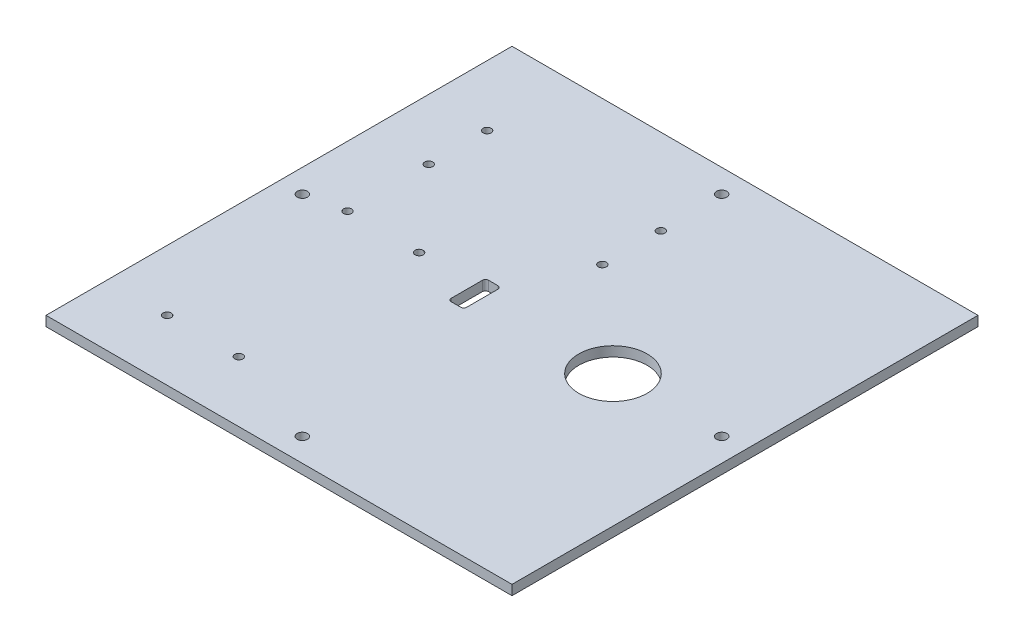
ISO-10303-21;
HEADER;
FILE_DESCRIPTION(('STEP AP214'),'2;1');
FILE_NAME('part.step','',(''),(''),'','','');
FILE_SCHEMA(('AUTOMOTIVE_DESIGN { 1 0 10303 214 1 1 1 1 }'));
ENDSEC;
DATA;
#1=APPLICATION_CONTEXT('core data for automotive mechanical design processes');
#2=APPLICATION_PROTOCOL_DEFINITION('international standard','automotive_design',2000,#1);
#3=PRODUCT_CONTEXT('',#1,'mechanical');
#4=PRODUCT('Part','Part','',(#3));
#5=PRODUCT_RELATED_PRODUCT_CATEGORY('part','',(#4));
#6=PRODUCT_DEFINITION_FORMATION('','',#4);
#7=PRODUCT_DEFINITION_CONTEXT('part definition',#1,'design');
#8=PRODUCT_DEFINITION('design','',#6,#7);
#9=PRODUCT_DEFINITION_SHAPE('','',#8);
#10=(LENGTH_UNIT() NAMED_UNIT(*) SI_UNIT(.MILLI.,.METRE.));
#11=(NAMED_UNIT(*) PLANE_ANGLE_UNIT() SI_UNIT($,.RADIAN.));
#12=(NAMED_UNIT(*) SI_UNIT($,.STERADIAN.) SOLID_ANGLE_UNIT());
#13=UNCERTAINTY_MEASURE_WITH_UNIT(LENGTH_MEASURE(1.E-05),#10,'distance_accuracy_value','');
#14=(GEOMETRIC_REPRESENTATION_CONTEXT(3) GLOBAL_UNCERTAINTY_ASSIGNED_CONTEXT((#13)) GLOBAL_UNIT_ASSIGNED_CONTEXT((#10,
#11,#12)) REPRESENTATION_CONTEXT('',''));
#15=CARTESIAN_POINT('',(0.,0.,0.));
#16=DIRECTION('',(0.,0.,1.));
#17=DIRECTION('',(1.,0.,0.));
#18=AXIS2_PLACEMENT_3D('',#15,#16,#17);
#19=CARTESIAN_POINT('',(0.,3.175,0.));
#20=DIRECTION('',(0.,1.,0.));
#21=DIRECTION('',(0.,0.,1.));
#22=AXIS2_PLACEMENT_3D('',#19,#20,#21);
#23=PLANE('',#22);
#24=CARTESIAN_POINT('',(-55.5,3.175,-47.5));
#25=DIRECTION('',(0.,1.,0.));
#26=DIRECTION('',(0.,0.,1.));
#27=AXIS2_PLACEMENT_3D('',#24,#25,#26);
#28=CIRCLE('',#27,1.3);
#29=CARTESIAN_POINT('',(-55.5,3.175,-46.2));
#30=VERTEX_POINT('',#29);
#31=EDGE_CURVE('E193',#30,#30,#28,.T.);
#32=ORIENTED_EDGE('',*,*,#31,.F.);
#33=EDGE_LOOP('',(#32));
#34=FACE_BOUND('',#33,.T.);
#35=CARTESIAN_POINT('',(0.400000000000032,3.175,-47.5));
#36=DIRECTION('',(0.,1.,0.));
#37=DIRECTION('',(0.,0.,1.));
#38=AXIS2_PLACEMENT_3D('',#35,#36,#37);
#39=CIRCLE('',#38,1.3);
#40=CARTESIAN_POINT('',(0.400000000000032,3.175,-46.2));
#41=VERTEX_POINT('',#40);
#42=EDGE_CURVE('E205',#41,#41,#39,.T.);
#43=ORIENTED_EDGE('',*,*,#42,.F.);
#44=EDGE_LOOP('',(#43));
#45=FACE_BOUND('',#44,.T.);
#46=CARTESIAN_POINT('',(-32.45,3.175,-2.54999999999999));
#47=DIRECTION('',(0.,1.,0.));
#48=DIRECTION('',(0.,0.,1.));
#49=AXIS2_PLACEMENT_3D('',#46,#47,#48);
#50=CIRCLE('',#49,1.3);
#51=CARTESIAN_POINT('',(-32.45,3.175,-1.24999999999999));
#52=VERTEX_POINT('',#51);
#53=EDGE_CURVE('E217',#52,#52,#50,.T.);
#54=ORIENTED_EDGE('',*,*,#53,.F.);
#55=EDGE_LOOP('',(#54));
#56=FACE_BOUND('',#55,.T.);
#57=CARTESIAN_POINT('',(-55.5,3.175,55.5));
#58=DIRECTION('',(0.,1.,0.));
#59=DIRECTION('',(0.,0.,1.));
#60=AXIS2_PLACEMENT_3D('',#57,#58,#59);
#61=CIRCLE('',#60,1.3);
#62=CARTESIAN_POINT('',(-55.5,3.175,56.8));
#63=VERTEX_POINT('',#62);
#64=EDGE_CURVE('E229',#63,#63,#61,.T.);
#65=ORIENTED_EDGE('',*,*,#64,.F.);
#66=EDGE_LOOP('',(#65));
#67=FACE_BOUND('',#66,.T.);
#68=CARTESIAN_POINT('',(0.,3.175,67.5));
#69=DIRECTION('',(0.,1.,0.));
#70=DIRECTION('',(0.,0.,1.));
#71=AXIS2_PLACEMENT_3D('',#68,#69,#70);
#72=CIRCLE('',#71,1.65);
#73=CARTESIAN_POINT('',(0.,3.175,69.15));
#74=VERTEX_POINT('',#73);
#75=EDGE_CURVE('E241',#74,#74,#72,.T.);
#76=ORIENTED_EDGE('',*,*,#75,.F.);
#77=EDGE_LOOP('',(#76));
#78=FACE_BOUND('',#77,.T.);
#79=CARTESIAN_POINT('',(0.,3.175,-67.5));
#80=DIRECTION('',(0.,1.,0.));
#81=DIRECTION('',(0.,0.,1.));
#82=AXIS2_PLACEMENT_3D('',#79,#80,#81);
#83=CIRCLE('',#82,1.65);
#84=CARTESIAN_POINT('',(0.,3.175,-65.85));
#85=VERTEX_POINT('',#84);
#86=EDGE_CURVE('E253',#85,#85,#83,.T.);
#87=ORIENTED_EDGE('',*,*,#86,.F.);
#88=EDGE_LOOP('',(#87));
#89=FACE_BOUND('',#88,.T.);
#90=DIRECTION('',(0.,0.,-1.));
#91=VECTOR('',#90,1.);
#92=CARTESIAN_POINT('',(75.,3.175,-75.));
#93=LINE('',#92,#91);
#94=CARTESIAN_POINT('',(75.,3.175,75.));
#95=VERTEX_POINT('',#94);
#96=CARTESIAN_POINT('',(75.,3.175,-75.));
#97=VERTEX_POINT('',#96);
#98=EDGE_CURVE('E265',#95,#97,#93,.T.);
#99=ORIENTED_EDGE('',*,*,#98,.T.);
#100=DIRECTION('',(-1.,0.,0.));
#101=VECTOR('',#100,1.);
#102=CARTESIAN_POINT('',(-75.,3.175,-75.));
#103=LINE('',#102,#101);
#104=CARTESIAN_POINT('',(-75.,3.175,-75.));
#105=VERTEX_POINT('',#104);
#106=EDGE_CURVE('E268',#97,#105,#103,.T.);
#107=ORIENTED_EDGE('',*,*,#106,.T.);
#108=DIRECTION('',(0.,0.,1.));
#109=VECTOR('',#108,1.);
#110=CARTESIAN_POINT('',(-75.,3.175,-75.));
#111=LINE('',#110,#109);
#112=CARTESIAN_POINT('',(-75.,3.175,75.));
#113=VERTEX_POINT('',#112);
#114=EDGE_CURVE('E271',#105,#113,#111,.T.);
#115=ORIENTED_EDGE('',*,*,#114,.T.);
#116=DIRECTION('',(1.,0.,0.));
#117=VECTOR('',#116,1.);
#118=CARTESIAN_POINT('',(-75.,3.175,75.));
#119=LINE('',#118,#117);
#120=EDGE_CURVE('E273',#113,#95,#119,.T.);
#121=ORIENTED_EDGE('',*,*,#120,.T.);
#122=EDGE_LOOP('',(#99,#107,#115,#121));
#123=FACE_BOUND('',#122,.T.);
#124=CARTESIAN_POINT('',(-67.5,3.175,0.));
#125=DIRECTION('',(0.,1.,0.));
#126=DIRECTION('',(0.,0.,1.));
#127=AXIS2_PLACEMENT_3D('',#124,#125,#126);
#128=CIRCLE('',#127,1.65);
#129=CARTESIAN_POINT('',(-67.5,3.175,1.65000000000002));
#130=VERTEX_POINT('',#129);
#131=EDGE_CURVE('E259',#130,#130,#128,.T.);
#132=ORIENTED_EDGE('',*,*,#131,.F.);
#133=EDGE_LOOP('',(#132));
#134=FACE_BOUND('',#133,.T.);
#135=CARTESIAN_POINT('',(67.5,3.175,0.));
#136=DIRECTION('',(0.,1.,0.));
#137=DIRECTION('',(0.,0.,1.));
#138=AXIS2_PLACEMENT_3D('',#135,#136,#137);
#139=CIRCLE('',#138,1.65);
#140=CARTESIAN_POINT('',(67.5,3.175,1.65000000000002));
#141=VERTEX_POINT('',#140);
#142=EDGE_CURVE('E247',#141,#141,#139,.T.);
#143=ORIENTED_EDGE('',*,*,#142,.F.);
#144=EDGE_LOOP('',(#143));
#145=FACE_BOUND('',#144,.T.);
#146=CARTESIAN_POINT('',(32.5,3.175,0.));
#147=DIRECTION('',(0.,1.,0.));
#148=DIRECTION('',(0.,0.,1.));
#149=AXIS2_PLACEMENT_3D('',#146,#147,#148);
#150=CIRCLE('',#149,11.);
#151=CARTESIAN_POINT('',(32.5,3.175,11.));
#152=VERTEX_POINT('',#151);
#153=EDGE_CURVE('E235',#152,#152,#150,.T.);
#154=ORIENTED_EDGE('',*,*,#153,.F.);
#155=EDGE_LOOP('',(#154));
#156=FACE_BOUND('',#155,.T.);
#157=CARTESIAN_POINT('',(-32.45,3.175,55.5));
#158=DIRECTION('',(0.,1.,0.));
#159=DIRECTION('',(0.,0.,1.));
#160=AXIS2_PLACEMENT_3D('',#157,#158,#159);
#161=CIRCLE('',#160,1.3);
#162=CARTESIAN_POINT('',(-32.45,3.175,56.8));
#163=VERTEX_POINT('',#162);
#164=EDGE_CURVE('E223',#163,#163,#161,.T.);
#165=ORIENTED_EDGE('',*,*,#164,.F.);
#166=EDGE_LOOP('',(#165));
#167=FACE_BOUND('',#166,.T.);
#168=CARTESIAN_POINT('',(-55.5,3.175,-2.54999999999999));
#169=DIRECTION('',(0.,1.,0.));
#170=DIRECTION('',(0.,0.,1.));
#171=AXIS2_PLACEMENT_3D('',#168,#169,#170);
#172=CIRCLE('',#171,1.3);
#173=CARTESIAN_POINT('',(-55.5,3.175,-1.24999999999999));
#174=VERTEX_POINT('',#173);
#175=EDGE_CURVE('E211',#174,#174,#172,.T.);
#176=ORIENTED_EDGE('',*,*,#175,.F.);
#177=EDGE_LOOP('',(#176));
#178=FACE_BOUND('',#177,.T.);
#179=CARTESIAN_POINT('',(0.400000000000032,3.175,-28.7));
#180=DIRECTION('',(0.,1.,0.));
#181=DIRECTION('',(0.,0.,1.));
#182=AXIS2_PLACEMENT_3D('',#179,#180,#181);
#183=CIRCLE('',#182,1.30000000000001);
#184=CARTESIAN_POINT('',(0.400000000000032,3.175,-27.4));
#185=VERTEX_POINT('',#184);
#186=EDGE_CURVE('E199',#185,#185,#183,.T.);
#187=ORIENTED_EDGE('',*,*,#186,.F.);
#188=EDGE_LOOP('',(#187));
#189=FACE_BOUND('',#188,.T.);
#190=CARTESIAN_POINT('',(-55.5,3.175,-28.7));
#191=DIRECTION('',(0.,1.,0.));
#192=DIRECTION('',(0.,0.,1.));
#193=AXIS2_PLACEMENT_3D('',#190,#191,#192);
#194=CIRCLE('',#193,1.3);
#195=CARTESIAN_POINT('',(-55.5,3.175,-27.4));
#196=VERTEX_POINT('',#195);
#197=EDGE_CURVE('E187',#196,#196,#194,.T.);
#198=ORIENTED_EDGE('',*,*,#197,.F.);
#199=EDGE_LOOP('',(#198));
#200=FACE_BOUND('',#199,.T.);
#201=DIRECTION('',(1.,0.,0.));
#202=VECTOR('',#201,1.);
#203=CARTESIAN_POINT('',(-13.5342899910378,3.175,5.99999999999999));
#204=LINE('',#203,#202);
#205=CARTESIAN_POINT('',(-13.5342899910378,3.175,5.99999999999999));
#206=VERTEX_POINT('',#205);
#207=CARTESIAN_POINT('',(-10.5342899910378,3.175,5.99999999999998));
#208=VERTEX_POINT('',#207);
#209=EDGE_CURVE('E130',#206,#208,#204,.T.);
#210=ORIENTED_EDGE('',*,*,#209,.F.);
#211=CARTESIAN_POINT('',(-13.5342899910378,3.175,4.99999999999999));
#212=DIRECTION('',(0.,1.,0.));
#213=DIRECTION('',(0.,0.,-1.));
#214=AXIS2_PLACEMENT_3D('',#211,#212,#213);
#215=CIRCLE('',#214,1.);
#216=CARTESIAN_POINT('',(-14.5342899910378,3.175,4.99999999999999));
#217=VERTEX_POINT('',#216);
#218=EDGE_CURVE('E122',#217,#206,#215,.T.);
#219=ORIENTED_EDGE('',*,*,#218,.F.);
#220=DIRECTION('',(0.,0.,1.));
#221=VECTOR('',#220,1.);
#222=CARTESIAN_POINT('',(-14.5342899910378,3.175,4.99999999999999));
#223=LINE('',#222,#221);
#224=CARTESIAN_POINT('',(-14.5342899910378,3.175,-5.00000000000001));
#225=VERTEX_POINT('',#224);
#226=EDGE_CURVE('E155',#225,#217,#223,.T.);
#227=ORIENTED_EDGE('',*,*,#226,.F.);
#228=CARTESIAN_POINT('',(-13.5342899910378,3.175,-5.00000000000001));
#229=DIRECTION('',(0.,1.,0.));
#230=DIRECTION('',(0.,0.,-1.));
#231=AXIS2_PLACEMENT_3D('',#228,#229,#230);
#232=CIRCLE('',#231,1.);
#233=CARTESIAN_POINT('',(-13.5342899910378,3.175,-6.00000000000001));
#234=VERTEX_POINT('',#233);
#235=EDGE_CURVE('E153',#234,#225,#232,.T.);
#236=ORIENTED_EDGE('',*,*,#235,.F.);
#237=DIRECTION('',(-1.,0.,0.));
#238=VECTOR('',#237,1.);
#239=CARTESIAN_POINT('',(-13.5342899910378,3.175,-6.00000000000001));
#240=LINE('',#239,#238);
#241=CARTESIAN_POINT('',(-10.5342899910378,3.175,-6.00000000000001));
#242=VERTEX_POINT('',#241);
#243=EDGE_CURVE('E151',#242,#234,#240,.T.);
#244=ORIENTED_EDGE('',*,*,#243,.F.);
#245=CARTESIAN_POINT('',(-10.5342899910378,3.175,-5.00000000000001));
#246=DIRECTION('',(0.,1.,0.));
#247=DIRECTION('',(0.,0.,-1.));
#248=AXIS2_PLACEMENT_3D('',#245,#246,#247);
#249=CIRCLE('',#248,1.);
#250=CARTESIAN_POINT('',(-9.5342899910378,3.175,-5.00000000000001));
#251=VERTEX_POINT('',#250);
#252=EDGE_CURVE('E149',#251,#242,#249,.T.);
#253=ORIENTED_EDGE('',*,*,#252,.F.);
#254=DIRECTION('',(0.,0.,-1.));
#255=VECTOR('',#254,1.);
#256=CARTESIAN_POINT('',(-9.5342899910378,3.175,4.99999999999999));
#257=LINE('',#256,#255);
#258=CARTESIAN_POINT('',(-9.5342899910378,3.175,4.99999999999999));
#259=VERTEX_POINT('',#258);
#260=EDGE_CURVE('E145',#259,#251,#257,.T.);
#261=ORIENTED_EDGE('',*,*,#260,.F.);
#262=CARTESIAN_POINT('',(-10.5342899910378,3.175,4.99999999999999));
#263=DIRECTION('',(0.,1.,0.));
#264=DIRECTION('',(0.,0.,1.));
#265=AXIS2_PLACEMENT_3D('',#262,#263,#264);
#266=CIRCLE('',#265,1.);
#267=EDGE_CURVE('E143',#208,#259,#266,.T.);
#268=ORIENTED_EDGE('',*,*,#267,.F.);
#269=EDGE_LOOP('',(#210,#219,#227,#236,#244,#253,#261,#268));
#270=FACE_BOUND('',#269,.T.);
#271=ADVANCED_FACE('F33',(#34,#45,#56,#67,#78,#89,#123,#134,#145,#156,#167,#178,#189,#200,#270),
#23,.T.);
#272=CARTESIAN_POINT('',(0.,0.,0.));
#273=DIRECTION('',(0.,1.,0.));
#274=DIRECTION('',(0.,0.,1.));
#275=AXIS2_PLACEMENT_3D('',#272,#273,#274);
#276=PLANE('',#275);
#277=CARTESIAN_POINT('',(-55.5,0.,-28.7));
#278=DIRECTION('',(0.,1.,0.));
#279=DIRECTION('',(0.,0.,1.));
#280=AXIS2_PLACEMENT_3D('',#277,#278,#279);
#281=CIRCLE('',#280,1.3);
#282=CARTESIAN_POINT('',(-55.5,0.,-27.4));
#283=VERTEX_POINT('',#282);
#284=EDGE_CURVE('E138',#283,#283,#281,.T.);
#285=ORIENTED_EDGE('',*,*,#284,.T.);
#286=EDGE_LOOP('',(#285));
#287=FACE_BOUND('',#286,.T.);
#288=CARTESIAN_POINT('',(-55.5,0.,-47.5));
#289=DIRECTION('',(0.,1.,0.));
#290=DIRECTION('',(0.,0.,1.));
#291=AXIS2_PLACEMENT_3D('',#288,#289,#290);
#292=CIRCLE('',#291,1.3);
#293=CARTESIAN_POINT('',(-55.5,0.,-46.2));
#294=VERTEX_POINT('',#293);
#295=EDGE_CURVE('E190',#294,#294,#292,.T.);
#296=ORIENTED_EDGE('',*,*,#295,.T.);
#297=EDGE_LOOP('',(#296));
#298=FACE_BOUND('',#297,.T.);
#299=CARTESIAN_POINT('',(0.400000000000032,0.,-28.7));
#300=DIRECTION('',(0.,1.,0.));
#301=DIRECTION('',(0.,0.,1.));
#302=AXIS2_PLACEMENT_3D('',#299,#300,#301);
#303=CIRCLE('',#302,1.30000000000001);
#304=CARTESIAN_POINT('',(0.400000000000032,0.,-27.4));
#305=VERTEX_POINT('',#304);
#306=EDGE_CURVE('E196',#305,#305,#303,.T.);
#307=ORIENTED_EDGE('',*,*,#306,.T.);
#308=EDGE_LOOP('',(#307));
#309=FACE_BOUND('',#308,.T.);
#310=CARTESIAN_POINT('',(0.400000000000032,0.,-47.5));
#311=DIRECTION('',(0.,1.,0.));
#312=DIRECTION('',(0.,0.,1.));
#313=AXIS2_PLACEMENT_3D('',#310,#311,#312);
#314=CIRCLE('',#313,1.3);
#315=CARTESIAN_POINT('',(0.400000000000032,0.,-46.2));
#316=VERTEX_POINT('',#315);
#317=EDGE_CURVE('E202',#316,#316,#314,.T.);
#318=ORIENTED_EDGE('',*,*,#317,.T.);
#319=EDGE_LOOP('',(#318));
#320=FACE_BOUND('',#319,.T.);
#321=CARTESIAN_POINT('',(-55.5,0.,-2.54999999999999));
#322=DIRECTION('',(0.,1.,0.));
#323=DIRECTION('',(0.,0.,1.));
#324=AXIS2_PLACEMENT_3D('',#321,#322,#323);
#325=CIRCLE('',#324,1.3);
#326=CARTESIAN_POINT('',(-55.5,0.,-1.24999999999999));
#327=VERTEX_POINT('',#326);
#328=EDGE_CURVE('E208',#327,#327,#325,.T.);
#329=ORIENTED_EDGE('',*,*,#328,.T.);
#330=EDGE_LOOP('',(#329));
#331=FACE_BOUND('',#330,.T.);
#332=CARTESIAN_POINT('',(-32.45,0.,-2.54999999999999));
#333=DIRECTION('',(0.,1.,0.));
#334=DIRECTION('',(0.,0.,1.));
#335=AXIS2_PLACEMENT_3D('',#332,#333,#334);
#336=CIRCLE('',#335,1.3);
#337=CARTESIAN_POINT('',(-32.45,0.,-1.24999999999999));
#338=VERTEX_POINT('',#337);
#339=EDGE_CURVE('E214',#338,#338,#336,.T.);
#340=ORIENTED_EDGE('',*,*,#339,.T.);
#341=EDGE_LOOP('',(#340));
#342=FACE_BOUND('',#341,.T.);
#343=CARTESIAN_POINT('',(-32.45,0.,55.5));
#344=DIRECTION('',(0.,1.,0.));
#345=DIRECTION('',(0.,0.,1.));
#346=AXIS2_PLACEMENT_3D('',#343,#344,#345);
#347=CIRCLE('',#346,1.3);
#348=CARTESIAN_POINT('',(-32.45,0.,56.8));
#349=VERTEX_POINT('',#348);
#350=EDGE_CURVE('E220',#349,#349,#347,.T.);
#351=ORIENTED_EDGE('',*,*,#350,.T.);
#352=EDGE_LOOP('',(#351));
#353=FACE_BOUND('',#352,.T.);
#354=CARTESIAN_POINT('',(-55.5,0.,55.5));
#355=DIRECTION('',(0.,1.,0.));
#356=DIRECTION('',(0.,0.,1.));
#357=AXIS2_PLACEMENT_3D('',#354,#355,#356);
#358=CIRCLE('',#357,1.3);
#359=CARTESIAN_POINT('',(-55.5,0.,56.8));
#360=VERTEX_POINT('',#359);
#361=EDGE_CURVE('E226',#360,#360,#358,.T.);
#362=ORIENTED_EDGE('',*,*,#361,.T.);
#363=EDGE_LOOP('',(#362));
#364=FACE_BOUND('',#363,.T.);
#365=CARTESIAN_POINT('',(32.5,0.,0.));
#366=DIRECTION('',(0.,1.,0.));
#367=DIRECTION('',(0.,0.,1.));
#368=AXIS2_PLACEMENT_3D('',#365,#366,#367);
#369=CIRCLE('',#368,11.);
#370=CARTESIAN_POINT('',(32.5,0.,11.));
#371=VERTEX_POINT('',#370);
#372=EDGE_CURVE('E232',#371,#371,#369,.T.);
#373=ORIENTED_EDGE('',*,*,#372,.T.);
#374=EDGE_LOOP('',(#373));
#375=FACE_BOUND('',#374,.T.);
#376=CARTESIAN_POINT('',(0.,0.,67.5));
#377=DIRECTION('',(0.,1.,0.));
#378=DIRECTION('',(0.,0.,1.));
#379=AXIS2_PLACEMENT_3D('',#376,#377,#378);
#380=CIRCLE('',#379,1.65);
#381=CARTESIAN_POINT('',(0.,0.,69.15));
#382=VERTEX_POINT('',#381);
#383=EDGE_CURVE('E238',#382,#382,#380,.T.);
#384=ORIENTED_EDGE('',*,*,#383,.T.);
#385=EDGE_LOOP('',(#384));
#386=FACE_BOUND('',#385,.T.);
#387=CARTESIAN_POINT('',(67.5,0.,0.));
#388=DIRECTION('',(0.,1.,0.));
#389=DIRECTION('',(0.,0.,1.));
#390=AXIS2_PLACEMENT_3D('',#387,#388,#389);
#391=CIRCLE('',#390,1.65);
#392=CARTESIAN_POINT('',(67.5,0.,1.65000000000002));
#393=VERTEX_POINT('',#392);
#394=EDGE_CURVE('E244',#393,#393,#391,.T.);
#395=ORIENTED_EDGE('',*,*,#394,.T.);
#396=EDGE_LOOP('',(#395));
#397=FACE_BOUND('',#396,.T.);
#398=CARTESIAN_POINT('',(0.,0.,-67.5));
#399=DIRECTION('',(0.,1.,0.));
#400=DIRECTION('',(0.,0.,1.));
#401=AXIS2_PLACEMENT_3D('',#398,#399,#400);
#402=CIRCLE('',#401,1.65);
#403=CARTESIAN_POINT('',(0.,0.,-65.85));
#404=VERTEX_POINT('',#403);
#405=EDGE_CURVE('E250',#404,#404,#402,.T.);
#406=ORIENTED_EDGE('',*,*,#405,.T.);
#407=EDGE_LOOP('',(#406));
#408=FACE_BOUND('',#407,.T.);
#409=CARTESIAN_POINT('',(-67.5,0.,0.));
#410=DIRECTION('',(0.,1.,0.));
#411=DIRECTION('',(0.,0.,1.));
#412=AXIS2_PLACEMENT_3D('',#409,#410,#411);
#413=CIRCLE('',#412,1.65);
#414=CARTESIAN_POINT('',(-67.5,0.,1.65000000000002));
#415=VERTEX_POINT('',#414);
#416=EDGE_CURVE('E256',#415,#415,#413,.T.);
#417=ORIENTED_EDGE('',*,*,#416,.T.);
#418=EDGE_LOOP('',(#417));
#419=FACE_BOUND('',#418,.T.);
#420=DIRECTION('',(0.,0.,-1.));
#421=VECTOR('',#420,1.);
#422=CARTESIAN_POINT('',(75.,0.,-75.));
#423=LINE('',#422,#421);
#424=CARTESIAN_POINT('',(75.,0.,75.));
#425=VERTEX_POINT('',#424);
#426=CARTESIAN_POINT('',(75.,0.,-75.));
#427=VERTEX_POINT('',#426);
#428=EDGE_CURVE('E262',#425,#427,#423,.T.);
#429=ORIENTED_EDGE('',*,*,#428,.F.);
#430=DIRECTION('',(1.,0.,0.));
#431=VECTOR('',#430,1.);
#432=CARTESIAN_POINT('',(-75.,0.,75.));
#433=LINE('',#432,#431);
#434=CARTESIAN_POINT('',(-75.,0.,75.));
#435=VERTEX_POINT('',#434);
#436=EDGE_CURVE('E269',#435,#425,#433,.T.);
#437=ORIENTED_EDGE('',*,*,#436,.F.);
#438=DIRECTION('',(0.,0.,1.));
#439=VECTOR('',#438,1.);
#440=CARTESIAN_POINT('',(-75.,0.,-75.));
#441=LINE('',#440,#439);
#442=CARTESIAN_POINT('',(-75.,0.,-75.));
#443=VERTEX_POINT('',#442);
#444=EDGE_CURVE('E280',#443,#435,#441,.T.);
#445=ORIENTED_EDGE('',*,*,#444,.F.);
#446=DIRECTION('',(-1.,0.,0.));
#447=VECTOR('',#446,1.);
#448=CARTESIAN_POINT('',(-75.,0.,-75.));
#449=LINE('',#448,#447);
#450=EDGE_CURVE('E278',#427,#443,#449,.T.);
#451=ORIENTED_EDGE('',*,*,#450,.F.);
#452=EDGE_LOOP('',(#429,#437,#445,#451));
#453=FACE_BOUND('',#452,.T.);
#454=CARTESIAN_POINT('',(-13.5342899910378,0.,4.99999999999999));
#455=DIRECTION('',(0.,1.,0.));
#456=DIRECTION('',(0.,0.,-1.));
#457=AXIS2_PLACEMENT_3D('',#454,#455,#456);
#458=CIRCLE('',#457,1.);
#459=CARTESIAN_POINT('',(-14.5342899910378,0.,4.99999999999999));
#460=VERTEX_POINT('',#459);
#461=CARTESIAN_POINT('',(-13.5342899910378,0.,5.99999999999999));
#462=VERTEX_POINT('',#461);
#463=EDGE_CURVE('E56',#460,#462,#458,.T.);
#464=ORIENTED_EDGE('',*,*,#463,.T.);
#465=DIRECTION('',(1.,0.,0.));
#466=VECTOR('',#465,1.);
#467=CARTESIAN_POINT('',(-13.5342899910378,0.,5.99999999999999));
#468=LINE('',#467,#466);
#469=CARTESIAN_POINT('',(-10.5342899910378,0.,5.99999999999998));
#470=VERTEX_POINT('',#469);
#471=EDGE_CURVE('E137',#462,#470,#468,.T.);
#472=ORIENTED_EDGE('',*,*,#471,.T.);
#473=CARTESIAN_POINT('',(-10.5342899910378,0.,4.99999999999999));
#474=DIRECTION('',(0.,1.,0.));
#475=DIRECTION('',(0.,0.,1.));
#476=AXIS2_PLACEMENT_3D('',#473,#474,#475);
#477=CIRCLE('',#476,1.);
#478=CARTESIAN_POINT('',(-9.5342899910378,0.,4.99999999999999));
#479=VERTEX_POINT('',#478);
#480=EDGE_CURVE('E159',#470,#479,#477,.T.);
#481=ORIENTED_EDGE('',*,*,#480,.T.);
#482=DIRECTION('',(0.,0.,-1.));
#483=VECTOR('',#482,1.);
#484=CARTESIAN_POINT('',(-9.5342899910378,0.,4.99999999999999));
#485=LINE('',#484,#483);
#486=CARTESIAN_POINT('',(-9.5342899910378,0.,-5.00000000000001));
#487=VERTEX_POINT('',#486);
#488=EDGE_CURVE('E162',#479,#487,#485,.T.);
#489=ORIENTED_EDGE('',*,*,#488,.T.);
#490=CARTESIAN_POINT('',(-10.5342899910378,0.,-5.00000000000001));
#491=DIRECTION('',(0.,1.,0.));
#492=DIRECTION('',(0.,0.,-1.));
#493=AXIS2_PLACEMENT_3D('',#490,#491,#492);
#494=CIRCLE('',#493,1.);
#495=CARTESIAN_POINT('',(-10.5342899910378,0.,-6.00000000000001));
#496=VERTEX_POINT('',#495);
#497=EDGE_CURVE('E165',#487,#496,#494,.T.);
#498=ORIENTED_EDGE('',*,*,#497,.T.);
#499=DIRECTION('',(-1.,0.,0.));
#500=VECTOR('',#499,1.);
#501=CARTESIAN_POINT('',(-13.5342899910378,0.,-6.00000000000001));
#502=LINE('',#501,#500);
#503=CARTESIAN_POINT('',(-13.5342899910378,0.,-6.00000000000001));
#504=VERTEX_POINT('',#503);
#505=EDGE_CURVE('E168',#496,#504,#502,.T.);
#506=ORIENTED_EDGE('',*,*,#505,.T.);
#507=CARTESIAN_POINT('',(-13.5342899910378,0.,-5.00000000000001));
#508=DIRECTION('',(0.,1.,0.));
#509=DIRECTION('',(0.,0.,-1.));
#510=AXIS2_PLACEMENT_3D('',#507,#508,#509);
#511=CIRCLE('',#510,1.);
#512=CARTESIAN_POINT('',(-14.5342899910378,0.,-5.00000000000001));
#513=VERTEX_POINT('',#512);
#514=EDGE_CURVE('E171',#504,#513,#511,.T.);
#515=ORIENTED_EDGE('',*,*,#514,.T.);
#516=DIRECTION('',(0.,0.,1.));
#517=VECTOR('',#516,1.);
#518=CARTESIAN_POINT('',(-14.5342899910378,0.,4.99999999999999));
#519=LINE('',#518,#517);
#520=EDGE_CURVE('E131',#513,#460,#519,.T.);
#521=ORIENTED_EDGE('',*,*,#520,.T.);
#522=EDGE_LOOP('',(#464,#472,#481,#489,#498,#506,#515,#521));
#523=FACE_BOUND('',#522,.T.);
#524=ADVANCED_FACE('F298',(#287,#298,#309,#320,#331,#342,#353,#364,#375,#386,#397,#408,#419,
#453,#523),#276,.F.);
#525=CARTESIAN_POINT('',(75.,3.175,-75.));
#526=DIRECTION('',(-1.,0.,0.));
#527=DIRECTION('',(0.,0.,1.));
#528=AXIS2_PLACEMENT_3D('',#525,#526,#527);
#529=PLANE('',#528);
#530=ORIENTED_EDGE('',*,*,#428,.T.);
#531=DIRECTION('',(0.,-1.,0.));
#532=VECTOR('',#531,1.);
#533=CARTESIAN_POINT('',(75.,3.175,-75.));
#534=LINE('',#533,#532);
#535=EDGE_CURVE('E11',#97,#427,#534,.T.);
#536=ORIENTED_EDGE('',*,*,#535,.F.);
#537=ORIENTED_EDGE('',*,*,#98,.F.);
#538=DIRECTION('',(0.,-1.,0.));
#539=VECTOR('',#538,1.);
#540=CARTESIAN_POINT('',(75.,3.175,75.));
#541=LINE('',#540,#539);
#542=EDGE_CURVE('E275',#95,#425,#541,.T.);
#543=ORIENTED_EDGE('',*,*,#542,.T.);
#544=EDGE_LOOP('',(#530,#536,#537,#543));
#545=FACE_BOUND('',#544,.T.);
#546=ADVANCED_FACE('F35',(#545),#529,.F.);
#547=CARTESIAN_POINT('',(-75.,3.175,-75.));
#548=DIRECTION('',(0.,0.,1.));
#549=DIRECTION('',(1.,0.,0.));
#550=AXIS2_PLACEMENT_3D('',#547,#548,#549);
#551=PLANE('',#550);
#552=ORIENTED_EDGE('',*,*,#450,.T.);
#553=DIRECTION('',(0.,-1.,0.));
#554=VECTOR('',#553,1.);
#555=CARTESIAN_POINT('',(-75.,3.175,-75.));
#556=LINE('',#555,#554);
#557=EDGE_CURVE('E41',#105,#443,#556,.T.);
#558=ORIENTED_EDGE('',*,*,#557,.F.);
#559=ORIENTED_EDGE('',*,*,#106,.F.);
#560=ORIENTED_EDGE('',*,*,#535,.T.);
#561=EDGE_LOOP('',(#552,#558,#559,#560));
#562=FACE_BOUND('',#561,.T.);
#563=ADVANCED_FACE('F309',(#562),#551,.F.);
#564=CARTESIAN_POINT('',(-75.,3.175,-75.));
#565=DIRECTION('',(1.,0.,0.));
#566=DIRECTION('',(0.,0.,-1.));
#567=AXIS2_PLACEMENT_3D('',#564,#565,#566);
#568=PLANE('',#567);
#569=ORIENTED_EDGE('',*,*,#444,.T.);
#570=DIRECTION('',(0.,-1.,0.));
#571=VECTOR('',#570,1.);
#572=CARTESIAN_POINT('',(-75.,3.175,75.));
#573=LINE('',#572,#571);
#574=EDGE_CURVE('E285',#113,#435,#573,.T.);
#575=ORIENTED_EDGE('',*,*,#574,.F.);
#576=ORIENTED_EDGE('',*,*,#114,.F.);
#577=ORIENTED_EDGE('',*,*,#557,.T.);
#578=EDGE_LOOP('',(#569,#575,#576,#577));
#579=FACE_BOUND('',#578,.T.);
#580=ADVANCED_FACE('F292',(#579),#568,.F.);
#581=CARTESIAN_POINT('',(-75.,3.175,75.));
#582=DIRECTION('',(0.,0.,-1.));
#583=DIRECTION('',(-1.,0.,0.));
#584=AXIS2_PLACEMENT_3D('',#581,#582,#583);
#585=PLANE('',#584);
#586=ORIENTED_EDGE('',*,*,#436,.T.);
#587=ORIENTED_EDGE('',*,*,#542,.F.);
#588=ORIENTED_EDGE('',*,*,#120,.F.);
#589=ORIENTED_EDGE('',*,*,#574,.T.);
#590=EDGE_LOOP('',(#586,#587,#588,#589));
#591=FACE_BOUND('',#590,.T.);
#592=ADVANCED_FACE('F302',(#591),#585,.F.);
#593=CARTESIAN_POINT('',(-67.5,3.175,0.));
#594=DIRECTION('',(0.,-1.,0.));
#595=DIRECTION('',(0.,0.,-1.));
#596=AXIS2_PLACEMENT_3D('',#593,#594,#595);
#597=CYLINDRICAL_SURFACE('',#596,1.65);
#598=ORIENTED_EDGE('',*,*,#131,.T.);
#599=EDGE_LOOP('',(#598));
#600=FACE_BOUND('',#599,.T.);
#601=ORIENTED_EDGE('',*,*,#416,.F.);
#602=EDGE_LOOP('',(#601));
#603=FACE_BOUND('',#602,.T.);
#604=ADVANCED_FACE('F327',(#600,#603),#597,.F.);
#605=CARTESIAN_POINT('',(0.,3.175,-67.5));
#606=DIRECTION('',(0.,-1.,0.));
#607=DIRECTION('',(0.,0.,-1.));
#608=AXIS2_PLACEMENT_3D('',#605,#606,#607);
#609=CYLINDRICAL_SURFACE('',#608,1.65);
#610=ORIENTED_EDGE('',*,*,#86,.T.);
#611=EDGE_LOOP('',(#610));
#612=FACE_BOUND('',#611,.T.);
#613=ORIENTED_EDGE('',*,*,#405,.F.);
#614=EDGE_LOOP('',(#613));
#615=FACE_BOUND('',#614,.T.);
#616=ADVANCED_FACE('F334',(#612,#615),#609,.F.);
#617=CARTESIAN_POINT('',(67.5,3.175,0.));
#618=DIRECTION('',(0.,-1.,0.));
#619=DIRECTION('',(0.,0.,-1.));
#620=AXIS2_PLACEMENT_3D('',#617,#618,#619);
#621=CYLINDRICAL_SURFACE('',#620,1.65);
#622=ORIENTED_EDGE('',*,*,#142,.T.);
#623=EDGE_LOOP('',(#622));
#624=FACE_BOUND('',#623,.T.);
#625=ORIENTED_EDGE('',*,*,#394,.F.);
#626=EDGE_LOOP('',(#625));
#627=FACE_BOUND('',#626,.T.);
#628=ADVANCED_FACE('F339',(#624,#627),#621,.F.);
#629=CARTESIAN_POINT('',(0.,3.175,67.5));
#630=DIRECTION('',(0.,-1.,0.));
#631=DIRECTION('',(0.,0.,-1.));
#632=AXIS2_PLACEMENT_3D('',#629,#630,#631);
#633=CYLINDRICAL_SURFACE('',#632,1.65);
#634=ORIENTED_EDGE('',*,*,#75,.T.);
#635=EDGE_LOOP('',(#634));
#636=FACE_BOUND('',#635,.T.);
#637=ORIENTED_EDGE('',*,*,#383,.F.);
#638=EDGE_LOOP('',(#637));
#639=FACE_BOUND('',#638,.T.);
#640=ADVANCED_FACE('F389',(#636,#639),#633,.F.);
#641=CARTESIAN_POINT('',(32.5,3.175,0.));
#642=DIRECTION('',(0.,-1.,0.));
#643=DIRECTION('',(0.,0.,-1.));
#644=AXIS2_PLACEMENT_3D('',#641,#642,#643);
#645=CYLINDRICAL_SURFACE('',#644,11.);
#646=ORIENTED_EDGE('',*,*,#153,.T.);
#647=EDGE_LOOP('',(#646));
#648=FACE_BOUND('',#647,.T.);
#649=ORIENTED_EDGE('',*,*,#372,.F.);
#650=EDGE_LOOP('',(#649));
#651=FACE_BOUND('',#650,.T.);
#652=ADVANCED_FACE('F395',(#648,#651),#645,.F.);
#653=CARTESIAN_POINT('',(-55.5,3.175,55.5));
#654=DIRECTION('',(0.,-1.,0.));
#655=DIRECTION('',(0.,0.,-1.));
#656=AXIS2_PLACEMENT_3D('',#653,#654,#655);
#657=CYLINDRICAL_SURFACE('',#656,1.3);
#658=ORIENTED_EDGE('',*,*,#64,.T.);
#659=EDGE_LOOP('',(#658));
#660=FACE_BOUND('',#659,.T.);
#661=ORIENTED_EDGE('',*,*,#361,.F.);
#662=EDGE_LOOP('',(#661));
#663=FACE_BOUND('',#662,.T.);
#664=ADVANCED_FACE('F401',(#660,#663),#657,.F.);
#665=CARTESIAN_POINT('',(-32.45,3.175,55.5));
#666=DIRECTION('',(0.,-1.,0.));
#667=DIRECTION('',(0.,0.,-1.));
#668=AXIS2_PLACEMENT_3D('',#665,#666,#667);
#669=CYLINDRICAL_SURFACE('',#668,1.3);
#670=ORIENTED_EDGE('',*,*,#164,.T.);
#671=EDGE_LOOP('',(#670));
#672=FACE_BOUND('',#671,.T.);
#673=ORIENTED_EDGE('',*,*,#350,.F.);
#674=EDGE_LOOP('',(#673));
#675=FACE_BOUND('',#674,.T.);
#676=ADVANCED_FACE('F405',(#672,#675),#669,.F.);
#677=CARTESIAN_POINT('',(-32.45,3.175,-2.54999999999999));
#678=DIRECTION('',(0.,-1.,0.));
#679=DIRECTION('',(0.,0.,-1.));
#680=AXIS2_PLACEMENT_3D('',#677,#678,#679);
#681=CYLINDRICAL_SURFACE('',#680,1.3);
#682=ORIENTED_EDGE('',*,*,#53,.T.);
#683=EDGE_LOOP('',(#682));
#684=FACE_BOUND('',#683,.T.);
#685=ORIENTED_EDGE('',*,*,#339,.F.);
#686=EDGE_LOOP('',(#685));
#687=FACE_BOUND('',#686,.T.);
#688=ADVANCED_FACE('F409',(#684,#687),#681,.F.);
#689=CARTESIAN_POINT('',(-55.5,3.175,-2.54999999999999));
#690=DIRECTION('',(0.,-1.,0.));
#691=DIRECTION('',(0.,0.,-1.));
#692=AXIS2_PLACEMENT_3D('',#689,#690,#691);
#693=CYLINDRICAL_SURFACE('',#692,1.3);
#694=ORIENTED_EDGE('',*,*,#175,.T.);
#695=EDGE_LOOP('',(#694));
#696=FACE_BOUND('',#695,.T.);
#697=ORIENTED_EDGE('',*,*,#328,.F.);
#698=EDGE_LOOP('',(#697));
#699=FACE_BOUND('',#698,.T.);
#700=ADVANCED_FACE('F413',(#696,#699),#693,.F.);
#701=CARTESIAN_POINT('',(0.400000000000032,3.175,-47.5));
#702=DIRECTION('',(0.,-1.,0.));
#703=DIRECTION('',(0.,0.,-1.));
#704=AXIS2_PLACEMENT_3D('',#701,#702,#703);
#705=CYLINDRICAL_SURFACE('',#704,1.3);
#706=ORIENTED_EDGE('',*,*,#42,.T.);
#707=EDGE_LOOP('',(#706));
#708=FACE_BOUND('',#707,.T.);
#709=ORIENTED_EDGE('',*,*,#317,.F.);
#710=EDGE_LOOP('',(#709));
#711=FACE_BOUND('',#710,.T.);
#712=ADVANCED_FACE('F417',(#708,#711),#705,.F.);
#713=CARTESIAN_POINT('',(0.400000000000032,3.175,-28.7));
#714=DIRECTION('',(0.,-1.,0.));
#715=DIRECTION('',(0.,0.,-1.));
#716=AXIS2_PLACEMENT_3D('',#713,#714,#715);
#717=CYLINDRICAL_SURFACE('',#716,1.30000000000001);
#718=ORIENTED_EDGE('',*,*,#186,.T.);
#719=EDGE_LOOP('',(#718));
#720=FACE_BOUND('',#719,.T.);
#721=ORIENTED_EDGE('',*,*,#306,.F.);
#722=EDGE_LOOP('',(#721));
#723=FACE_BOUND('',#722,.T.);
#724=ADVANCED_FACE('F421',(#720,#723),#717,.F.);
#725=CARTESIAN_POINT('',(-55.5,3.175,-47.5));
#726=DIRECTION('',(0.,-1.,0.));
#727=DIRECTION('',(0.,0.,-1.));
#728=AXIS2_PLACEMENT_3D('',#725,#726,#727);
#729=CYLINDRICAL_SURFACE('',#728,1.3);
#730=ORIENTED_EDGE('',*,*,#31,.T.);
#731=EDGE_LOOP('',(#730));
#732=FACE_BOUND('',#731,.T.);
#733=ORIENTED_EDGE('',*,*,#295,.F.);
#734=EDGE_LOOP('',(#733));
#735=FACE_BOUND('',#734,.T.);
#736=ADVANCED_FACE('F361',(#732,#735),#729,.F.);
#737=CARTESIAN_POINT('',(-55.5,3.175,-28.7));
#738=DIRECTION('',(0.,-1.,0.));
#739=DIRECTION('',(0.,0.,-1.));
#740=AXIS2_PLACEMENT_3D('',#737,#738,#739);
#741=CYLINDRICAL_SURFACE('',#740,1.3);
#742=ORIENTED_EDGE('',*,*,#197,.T.);
#743=EDGE_LOOP('',(#742));
#744=FACE_BOUND('',#743,.T.);
#745=ORIENTED_EDGE('',*,*,#284,.F.);
#746=EDGE_LOOP('',(#745));
#747=FACE_BOUND('',#746,.T.);
#748=ADVANCED_FACE('F358',(#744,#747),#741,.F.);
#749=CARTESIAN_POINT('',(-13.5342899910378,3.175,4.99999999999999));
#750=DIRECTION('',(0.,-1.,0.));
#751=DIRECTION('',(0.,0.,-1.));
#752=AXIS2_PLACEMENT_3D('',#749,#750,#751);
#753=CYLINDRICAL_SURFACE('',#752,1.);
#754=ORIENTED_EDGE('',*,*,#463,.F.);
#755=DIRECTION('',(0.,-1.,0.));
#756=VECTOR('',#755,1.);
#757=CARTESIAN_POINT('',(-14.5342899910378,3.175,4.99999999999999));
#758=LINE('',#757,#756);
#759=EDGE_CURVE('E126',#217,#460,#758,.T.);
#760=ORIENTED_EDGE('',*,*,#759,.F.);
#761=ORIENTED_EDGE('',*,*,#218,.T.);
#762=DIRECTION('',(0.,-1.,0.));
#763=VECTOR('',#762,1.);
#764=CARTESIAN_POINT('',(-13.5342899910378,3.175,5.99999999999999));
#765=LINE('',#764,#763);
#766=EDGE_CURVE('E125',#206,#462,#765,.T.);
#767=ORIENTED_EDGE('',*,*,#766,.T.);
#768=EDGE_LOOP('',(#754,#760,#761,#767));
#769=FACE_BOUND('',#768,.T.);
#770=ADVANCED_FACE('F124',(#769),#753,.F.);
#771=CARTESIAN_POINT('',(-13.5342899910378,3.175,5.99999999999999));
#772=DIRECTION('',(0.,0.,-1.));
#773=DIRECTION('',(-1.,0.,0.));
#774=AXIS2_PLACEMENT_3D('',#771,#772,#773);
#775=PLANE('',#774);
#776=ORIENTED_EDGE('',*,*,#471,.F.);
#777=ORIENTED_EDGE('',*,*,#766,.F.);
#778=ORIENTED_EDGE('',*,*,#209,.T.);
#779=DIRECTION('',(0.,-1.,0.));
#780=VECTOR('',#779,1.);
#781=CARTESIAN_POINT('',(-10.5342899910378,3.175,5.99999999999998));
#782=LINE('',#781,#780);
#783=EDGE_CURVE('E139',#208,#470,#782,.T.);
#784=ORIENTED_EDGE('',*,*,#783,.T.);
#785=EDGE_LOOP('',(#776,#777,#778,#784));
#786=FACE_BOUND('',#785,.T.);
#787=ADVANCED_FACE('F134',(#786),#775,.T.);
#788=CARTESIAN_POINT('',(-10.5342899910378,3.175,4.99999999999999));
#789=DIRECTION('',(0.,-1.,0.));
#790=DIRECTION('',(0.,0.,-1.));
#791=AXIS2_PLACEMENT_3D('',#788,#789,#790);
#792=CYLINDRICAL_SURFACE('',#791,1.);
#793=ORIENTED_EDGE('',*,*,#480,.F.);
#794=ORIENTED_EDGE('',*,*,#783,.F.);
#795=ORIENTED_EDGE('',*,*,#267,.T.);
#796=DIRECTION('',(0.,-1.,0.));
#797=VECTOR('',#796,1.);
#798=CARTESIAN_POINT('',(-9.5342899910378,3.175,4.99999999999999));
#799=LINE('',#798,#797);
#800=EDGE_CURVE('E184',#259,#479,#799,.T.);
#801=ORIENTED_EDGE('',*,*,#800,.T.);
#802=EDGE_LOOP('',(#793,#794,#795,#801));
#803=FACE_BOUND('',#802,.T.);
#804=ADVANCED_FACE('F433',(#803),#792,.F.);
#805=CARTESIAN_POINT('',(-9.5342899910378,3.175,4.99999999999999));
#806=DIRECTION('',(-1.,0.,0.));
#807=DIRECTION('',(0.,0.,1.));
#808=AXIS2_PLACEMENT_3D('',#805,#806,#807);
#809=PLANE('',#808);
#810=ORIENTED_EDGE('',*,*,#488,.F.);
#811=ORIENTED_EDGE('',*,*,#800,.F.);
#812=ORIENTED_EDGE('',*,*,#260,.T.);
#813=DIRECTION('',(0.,-1.,0.));
#814=VECTOR('',#813,1.);
#815=CARTESIAN_POINT('',(-9.5342899910378,3.175,-5.00000000000001));
#816=LINE('',#815,#814);
#817=EDGE_CURVE('E182',#251,#487,#816,.T.);
#818=ORIENTED_EDGE('',*,*,#817,.T.);
#819=EDGE_LOOP('',(#810,#811,#812,#818));
#820=FACE_BOUND('',#819,.T.);
#821=ADVANCED_FACE('F436',(#820),#809,.T.);
#822=CARTESIAN_POINT('',(-10.5342899910378,3.175,-5.00000000000001));
#823=DIRECTION('',(0.,-1.,0.));
#824=DIRECTION('',(0.,0.,-1.));
#825=AXIS2_PLACEMENT_3D('',#822,#823,#824);
#826=CYLINDRICAL_SURFACE('',#825,1.);
#827=ORIENTED_EDGE('',*,*,#497,.F.);
#828=ORIENTED_EDGE('',*,*,#817,.F.);
#829=ORIENTED_EDGE('',*,*,#252,.T.);
#830=DIRECTION('',(0.,-1.,0.));
#831=VECTOR('',#830,1.);
#832=CARTESIAN_POINT('',(-10.5342899910378,3.175,-6.00000000000001));
#833=LINE('',#832,#831);
#834=EDGE_CURVE('E180',#242,#496,#833,.T.);
#835=ORIENTED_EDGE('',*,*,#834,.T.);
#836=EDGE_LOOP('',(#827,#828,#829,#835));
#837=FACE_BOUND('',#836,.T.);
#838=ADVANCED_FACE('F440',(#837),#826,.F.);
#839=CARTESIAN_POINT('',(-13.5342899910378,3.175,-6.00000000000001));
#840=DIRECTION('',(0.,0.,1.));
#841=DIRECTION('',(1.,0.,0.));
#842=AXIS2_PLACEMENT_3D('',#839,#840,#841);
#843=PLANE('',#842);
#844=ORIENTED_EDGE('',*,*,#505,.F.);
#845=ORIENTED_EDGE('',*,*,#834,.F.);
#846=ORIENTED_EDGE('',*,*,#243,.T.);
#847=DIRECTION('',(0.,-1.,0.));
#848=VECTOR('',#847,1.);
#849=CARTESIAN_POINT('',(-13.5342899910378,3.175,-6.00000000000001));
#850=LINE('',#849,#848);
#851=EDGE_CURVE('E178',#234,#504,#850,.T.);
#852=ORIENTED_EDGE('',*,*,#851,.T.);
#853=EDGE_LOOP('',(#844,#845,#846,#852));
#854=FACE_BOUND('',#853,.T.);
#855=ADVANCED_FACE('F444',(#854),#843,.T.);
#856=CARTESIAN_POINT('',(-13.5342899910378,3.175,-5.00000000000001));
#857=DIRECTION('',(0.,-1.,0.));
#858=DIRECTION('',(0.,0.,-1.));
#859=AXIS2_PLACEMENT_3D('',#856,#857,#858);
#860=CYLINDRICAL_SURFACE('',#859,1.);
#861=ORIENTED_EDGE('',*,*,#514,.F.);
#862=ORIENTED_EDGE('',*,*,#851,.F.);
#863=ORIENTED_EDGE('',*,*,#235,.T.);
#864=DIRECTION('',(0.,-1.,0.));
#865=VECTOR('',#864,1.);
#866=CARTESIAN_POINT('',(-14.5342899910378,3.175,-5.00000000000001));
#867=LINE('',#866,#865);
#868=EDGE_CURVE('E48',#225,#513,#867,.T.);
#869=ORIENTED_EDGE('',*,*,#868,.T.);
#870=EDGE_LOOP('',(#861,#862,#863,#869));
#871=FACE_BOUND('',#870,.T.);
#872=ADVANCED_FACE('F448',(#871),#860,.F.);
#873=CARTESIAN_POINT('',(-14.5342899910378,3.175,4.99999999999999));
#874=DIRECTION('',(1.,0.,0.));
#875=DIRECTION('',(0.,0.,-1.));
#876=AXIS2_PLACEMENT_3D('',#873,#874,#875);
#877=PLANE('',#876);
#878=ORIENTED_EDGE('',*,*,#520,.F.);
#879=ORIENTED_EDGE('',*,*,#868,.F.);
#880=ORIENTED_EDGE('',*,*,#226,.T.);
#881=ORIENTED_EDGE('',*,*,#759,.T.);
#882=EDGE_LOOP('',(#878,#879,#880,#881));
#883=FACE_BOUND('',#882,.T.);
#884=ADVANCED_FACE('F452',(#883),#877,.T.);
#885=CLOSED_SHELL('',(#271,#524,#546,#563,#580,#592,#604,#616,#628,#640,#652,#664,#676,#688,
#700,#712,#724,#736,#748,#770,#787,#804,#821,#838,#855,#872,#884));
#886=MANIFOLD_SOLID_BREP('B2',#885);
#887=ADVANCED_BREP_SHAPE_REPRESENTATION('',(#18,#886),#14);
#888=SHAPE_DEFINITION_REPRESENTATION(#9,#887);
ENDSEC;
END-ISO-10303-21;
